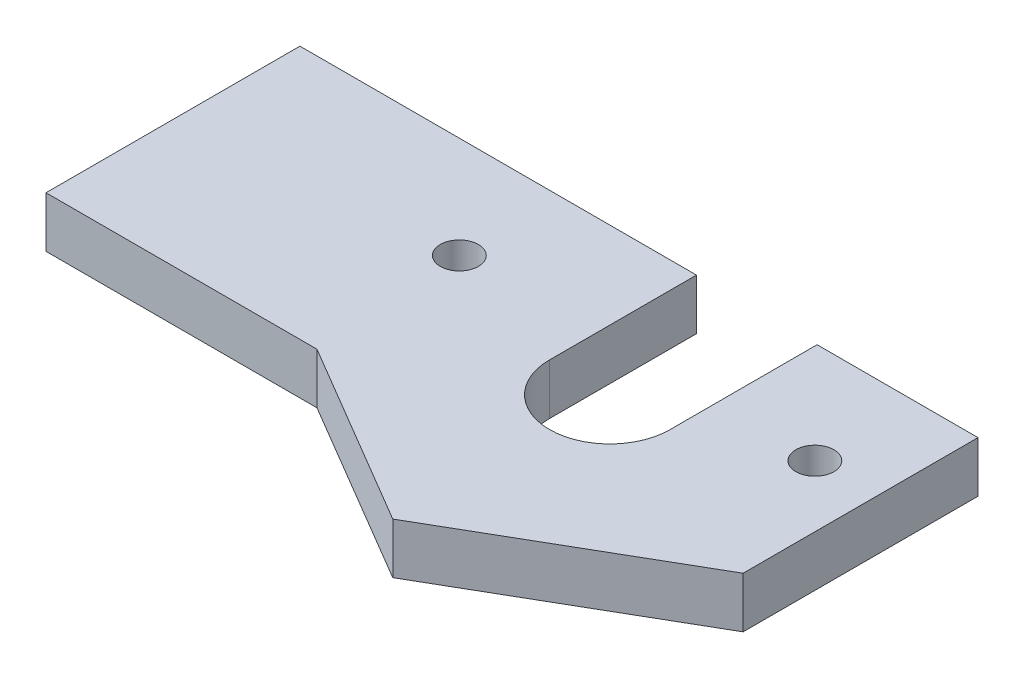
ISO-10303-21;
HEADER;
FILE_DESCRIPTION(('STEP AP214'),'2;1');
FILE_NAME('part.step','',(''),(''),'','','');
FILE_SCHEMA(('AUTOMOTIVE_DESIGN { 1 0 10303 214 1 1 1 1 }'));
ENDSEC;
DATA;
#1=APPLICATION_CONTEXT('core data for automotive mechanical design processes');
#2=APPLICATION_PROTOCOL_DEFINITION('international standard','automotive_design',2000,#1);
#3=PRODUCT_CONTEXT('',#1,'mechanical');
#4=PRODUCT('Part','Part','',(#3));
#5=PRODUCT_RELATED_PRODUCT_CATEGORY('part','',(#4));
#6=PRODUCT_DEFINITION_FORMATION('','',#4);
#7=PRODUCT_DEFINITION_CONTEXT('part definition',#1,'design');
#8=PRODUCT_DEFINITION('design','',#6,#7);
#9=PRODUCT_DEFINITION_SHAPE('','',#8);
#10=(LENGTH_UNIT() NAMED_UNIT(*) SI_UNIT(.MILLI.,.METRE.));
#11=(NAMED_UNIT(*) PLANE_ANGLE_UNIT() SI_UNIT($,.RADIAN.));
#12=(NAMED_UNIT(*) SI_UNIT($,.STERADIAN.) SOLID_ANGLE_UNIT());
#13=UNCERTAINTY_MEASURE_WITH_UNIT(LENGTH_MEASURE(1.E-05),#10,'distance_accuracy_value','');
#14=(GEOMETRIC_REPRESENTATION_CONTEXT(3) GLOBAL_UNCERTAINTY_ASSIGNED_CONTEXT((#13)) GLOBAL_UNIT_ASSIGNED_CONTEXT((#10,
#11,#12)) REPRESENTATION_CONTEXT('',''));
#15=CARTESIAN_POINT('',(0.,0.,0.));
#16=DIRECTION('',(0.,0.,1.));
#17=DIRECTION('',(1.,0.,0.));
#18=AXIS2_PLACEMENT_3D('',#15,#16,#17);
#19=CARTESIAN_POINT('',(-168.355,8.,0.));
#20=DIRECTION('',(1.,0.,0.));
#21=DIRECTION('',(0.,0.,-1.));
#22=AXIS2_PLACEMENT_3D('',#19,#20,#21);
#23=PLANE('',#22);
#24=DIRECTION('',(0.,0.,1.));
#25=VECTOR('',#24,1.);
#26=CARTESIAN_POINT('',(-168.355,4.,0.));
#27=LINE('',#26,#25);
#28=CARTESIAN_POINT('',(-168.355,4.,-143.95));
#29=VERTEX_POINT('',#28);
#30=CARTESIAN_POINT('',(-168.355,4.,-123.950000000005));
#31=VERTEX_POINT('',#30);
#32=EDGE_CURVE('E152',#29,#31,#27,.T.);
#33=ORIENTED_EDGE('',*,*,#32,.T.);
#34=DIRECTION('',(0.,-1.,0.));
#35=VECTOR('',#34,1.);
#36=CARTESIAN_POINT('',(-168.355,8.,-123.950000000005));
#37=LINE('',#36,#35);
#38=CARTESIAN_POINT('',(-168.355,8.,-123.950000000005));
#39=VERTEX_POINT('',#38);
#40=EDGE_CURVE('E11',#39,#31,#37,.T.);
#41=ORIENTED_EDGE('',*,*,#40,.F.);
#42=DIRECTION('',(0.,0.,1.));
#43=VECTOR('',#42,1.);
#44=CARTESIAN_POINT('',(-168.355,8.,0.));
#45=LINE('',#44,#43);
#46=CARTESIAN_POINT('',(-168.355,8.,-143.95));
#47=VERTEX_POINT('',#46);
#48=EDGE_CURVE('E97',#47,#39,#45,.T.);
#49=ORIENTED_EDGE('',*,*,#48,.F.);
#50=DIRECTION('',(0.,-1.,0.));
#51=VECTOR('',#50,1.);
#52=CARTESIAN_POINT('',(-168.355,8.,-143.95));
#53=LINE('',#52,#51);
#54=EDGE_CURVE('E53',#47,#29,#53,.T.);
#55=ORIENTED_EDGE('',*,*,#54,.T.);
#56=EDGE_LOOP('',(#33,#41,#49,#55));
#57=FACE_BOUND('',#56,.T.);
#58=ADVANCED_FACE('F37',(#57),#23,.F.);
#59=CARTESIAN_POINT('',(0.,8.,-123.950000000005));
#60=DIRECTION('',(0.,0.,1.));
#61=DIRECTION('',(1.,0.,0.));
#62=AXIS2_PLACEMENT_3D('',#59,#60,#61);
#63=PLANE('',#62);
#64=DIRECTION('',(-1.,0.,0.));
#65=VECTOR('',#64,1.);
#66=CARTESIAN_POINT('',(0.,4.,-123.950000000005));
#67=LINE('',#66,#65);
#68=CARTESIAN_POINT('',(-147.01444531744,4.,-123.950000000005));
#69=VERTEX_POINT('',#68);
#70=EDGE_CURVE('E154',#69,#31,#67,.T.);
#71=ORIENTED_EDGE('',*,*,#70,.F.);
#72=DIRECTION('',(0.,-1.,0.));
#73=VECTOR('',#72,1.);
#74=CARTESIAN_POINT('',(-147.01444531744,8.,-123.950000000005));
#75=LINE('',#74,#73);
#76=CARTESIAN_POINT('',(-147.01444531744,8.,-123.950000000005));
#77=VERTEX_POINT('',#76);
#78=EDGE_CURVE('E45',#77,#69,#75,.T.);
#79=ORIENTED_EDGE('',*,*,#78,.F.);
#80=DIRECTION('',(-1.,0.,0.));
#81=VECTOR('',#80,1.);
#82=CARTESIAN_POINT('',(0.,8.,-123.950000000005));
#83=LINE('',#82,#81);
#84=EDGE_CURVE('E214',#77,#39,#83,.T.);
#85=ORIENTED_EDGE('',*,*,#84,.T.);
#86=ORIENTED_EDGE('',*,*,#40,.T.);
#87=EDGE_LOOP('',(#71,#79,#85,#86));
#88=FACE_BOUND('',#87,.T.);
#89=ADVANCED_FACE('F201',(#88),#63,.T.);
#90=CARTESIAN_POINT('',(16.2740149052026,8.,-27.5723578123821));
#91=DIRECTION('',(-0.508295367968957,0.,0.861182802255888));
#92=DIRECTION('',(0.861182802255888,0.,0.508295367968957));
#93=AXIS2_PLACEMENT_3D('',#90,#91,#92);
#94=PLANE('',#93);
#95=DIRECTION('',(-0.861182802255888,0.,-0.508295367968957));
#96=VECTOR('',#95,1.);
#97=CARTESIAN_POINT('',(16.2740149052026,4.,-27.5723578123821));
#98=LINE('',#97,#96);
#99=CARTESIAN_POINT('',(-132.445175955673,4.,-115.35078957467));
#100=VERTEX_POINT('',#99);
#101=EDGE_CURVE('E157',#100,#69,#98,.T.);
#102=ORIENTED_EDGE('',*,*,#101,.F.);
#103=DIRECTION('',(0.,-1.,0.));
#104=VECTOR('',#103,1.);
#105=CARTESIAN_POINT('',(-132.445175955673,8.,-115.35078957467));
#106=LINE('',#105,#104);
#107=CARTESIAN_POINT('',(-132.445175955673,8.,-115.35078957467));
#108=VERTEX_POINT('',#107);
#109=EDGE_CURVE('E191',#108,#100,#106,.T.);
#110=ORIENTED_EDGE('',*,*,#109,.F.);
#111=DIRECTION('',(-0.861182802255888,0.,-0.508295367968957));
#112=VECTOR('',#111,1.);
#113=CARTESIAN_POINT('',(16.2740149052026,8.,-27.5723578123821));
#114=LINE('',#113,#112);
#115=EDGE_CURVE('E198',#108,#77,#114,.T.);
#116=ORIENTED_EDGE('',*,*,#115,.T.);
#117=ORIENTED_EDGE('',*,*,#78,.T.);
#118=EDGE_LOOP('',(#102,#110,#116,#117));
#119=FACE_BOUND('',#118,.T.);
#120=ADVANCED_FACE('F196',(#119),#94,.T.);
#121=CARTESIAN_POINT('',(-83.0596510480491,8.,-143.863535674159));
#122=DIRECTION('',(0.50000000000001,0.,0.866025403784433));
#123=DIRECTION('',(0.866025403784433,0.,-0.50000000000001));
#124=AXIS2_PLACEMENT_3D('',#121,#122,#123);
#125=PLANE('',#124);
#126=DIRECTION('',(-0.866025403784433,0.,0.50000000000001));
#127=VECTOR('',#126,1.);
#128=CARTESIAN_POINT('',(-83.0596510480491,4.,-143.863535674159));
#129=LINE('',#128,#127);
#130=CARTESIAN_POINT('',(-114.951926063695,4.,-125.450522108806));
#131=VERTEX_POINT('',#130);
#132=EDGE_CURVE('E160',#131,#100,#129,.T.);
#133=ORIENTED_EDGE('',*,*,#132,.F.);
#134=DIRECTION('',(0.,-1.,0.));
#135=VECTOR('',#134,1.);
#136=CARTESIAN_POINT('',(-114.951926063695,8.,-125.450522108806));
#137=LINE('',#136,#135);
#138=CARTESIAN_POINT('',(-114.951926063695,8.,-125.450522108806));
#139=VERTEX_POINT('',#138);
#140=EDGE_CURVE('E189',#139,#131,#137,.T.);
#141=ORIENTED_EDGE('',*,*,#140,.F.);
#142=DIRECTION('',(-0.866025403784433,0.,0.50000000000001));
#143=VECTOR('',#142,1.);
#144=CARTESIAN_POINT('',(-83.0596510480491,8.,-143.863535674159));
#145=LINE('',#144,#143);
#146=EDGE_CURVE('E211',#139,#108,#145,.T.);
#147=ORIENTED_EDGE('',*,*,#146,.T.);
#148=ORIENTED_EDGE('',*,*,#109,.T.);
#149=EDGE_LOOP('',(#133,#141,#147,#148));
#150=FACE_BOUND('',#149,.T.);
#151=ADVANCED_FACE('F208',(#150),#125,.T.);
#152=CARTESIAN_POINT('',(-114.951926063695,8.,0.));
#153=DIRECTION('',(1.,0.,0.));
#154=DIRECTION('',(0.,0.,-1.));
#155=AXIS2_PLACEMENT_3D('',#152,#153,#154);
#156=PLANE('',#155);
#157=DIRECTION('',(0.,0.,1.));
#158=VECTOR('',#157,1.);
#159=CARTESIAN_POINT('',(-114.951926063695,4.,0.));
#160=LINE('',#159,#158);
#161=CARTESIAN_POINT('',(-114.951926063695,4.,-143.95));
#162=VERTEX_POINT('',#161);
#163=EDGE_CURVE('E163',#162,#131,#160,.T.);
#164=ORIENTED_EDGE('',*,*,#163,.F.);
#165=DIRECTION('',(0.,-1.,0.));
#166=VECTOR('',#165,1.);
#167=CARTESIAN_POINT('',(-114.951926063695,8.,-143.95));
#168=LINE('',#167,#166);
#169=CARTESIAN_POINT('',(-114.951926063695,8.,-143.95));
#170=VERTEX_POINT('',#169);
#171=EDGE_CURVE('E187',#170,#162,#168,.T.);
#172=ORIENTED_EDGE('',*,*,#171,.F.);
#173=DIRECTION('',(0.,0.,1.));
#174=VECTOR('',#173,1.);
#175=CARTESIAN_POINT('',(-114.951926063695,8.,0.));
#176=LINE('',#175,#174);
#177=EDGE_CURVE('E216',#170,#139,#176,.T.);
#178=ORIENTED_EDGE('',*,*,#177,.T.);
#179=ORIENTED_EDGE('',*,*,#140,.T.);
#180=EDGE_LOOP('',(#164,#172,#178,#179));
#181=FACE_BOUND('',#180,.T.);
#182=ADVANCED_FACE('F241',(#181),#156,.T.);
#183=CARTESIAN_POINT('',(0.,8.,-143.95));
#184=DIRECTION('',(0.,0.,-1.));
#185=DIRECTION('',(-1.,0.,0.));
#186=AXIS2_PLACEMENT_3D('',#183,#184,#185);
#187=PLANE('',#186);
#188=DIRECTION('',(1.,0.,0.));
#189=VECTOR('',#188,1.);
#190=CARTESIAN_POINT('',(0.,4.,-143.95));
#191=LINE('',#190,#189);
#192=CARTESIAN_POINT('',(-127.625,4.,-143.95));
#193=VERTEX_POINT('',#192);
#194=EDGE_CURVE('E166',#193,#162,#191,.T.);
#195=ORIENTED_EDGE('',*,*,#194,.F.);
#196=DIRECTION('',(0.,-1.,0.));
#197=VECTOR('',#196,1.);
#198=CARTESIAN_POINT('',(-127.625,8.,-143.95));
#199=LINE('',#198,#197);
#200=CARTESIAN_POINT('',(-127.625,8.,-143.95));
#201=VERTEX_POINT('',#200);
#202=EDGE_CURVE('E185',#201,#193,#199,.T.);
#203=ORIENTED_EDGE('',*,*,#202,.F.);
#204=DIRECTION('',(1.,0.,0.));
#205=VECTOR('',#204,1.);
#206=CARTESIAN_POINT('',(0.,8.,-143.95));
#207=LINE('',#206,#205);
#208=EDGE_CURVE('E142',#201,#170,#207,.T.);
#209=ORIENTED_EDGE('',*,*,#208,.T.);
#210=ORIENTED_EDGE('',*,*,#171,.T.);
#211=EDGE_LOOP('',(#195,#203,#209,#210));
#212=FACE_BOUND('',#211,.T.);
#213=ADVANCED_FACE('F229',(#212),#187,.T.);
#214=CARTESIAN_POINT('',(-127.625,8.,0.));
#215=DIRECTION('',(-1.,0.,0.));
#216=DIRECTION('',(0.,0.,1.));
#217=AXIS2_PLACEMENT_3D('',#214,#215,#216);
#218=PLANE('',#217);
#219=DIRECTION('',(0.,0.,-1.));
#220=VECTOR('',#219,1.);
#221=CARTESIAN_POINT('',(-127.625,4.,0.));
#222=LINE('',#221,#220);
#223=CARTESIAN_POINT('',(-127.625,4.,-132.375000000014));
#224=VERTEX_POINT('',#223);
#225=EDGE_CURVE('E169',#224,#193,#222,.T.);
#226=ORIENTED_EDGE('',*,*,#225,.F.);
#227=DIRECTION('',(0.,-1.,0.));
#228=VECTOR('',#227,1.);
#229=CARTESIAN_POINT('',(-127.625,8.,-132.375000000014));
#230=LINE('',#229,#228);
#231=CARTESIAN_POINT('',(-127.625,8.,-132.375000000014));
#232=VERTEX_POINT('',#231);
#233=EDGE_CURVE('E129',#232,#224,#230,.T.);
#234=ORIENTED_EDGE('',*,*,#233,.F.);
#235=DIRECTION('',(0.,0.,-1.));
#236=VECTOR('',#235,1.);
#237=CARTESIAN_POINT('',(-127.625,8.,0.));
#238=LINE('',#237,#236);
#239=EDGE_CURVE('E140',#232,#201,#238,.T.);
#240=ORIENTED_EDGE('',*,*,#239,.T.);
#241=ORIENTED_EDGE('',*,*,#202,.T.);
#242=EDGE_LOOP('',(#226,#234,#240,#241));
#243=FACE_BOUND('',#242,.T.);
#244=ADVANCED_FACE('F240',(#243),#218,.T.);
#245=CARTESIAN_POINT('',(-132.375,8.,-132.375000000014));
#246=DIRECTION('',(0.,-1.,0.));
#247=DIRECTION('',(0.,0.,-1.));
#248=AXIS2_PLACEMENT_3D('',#245,#246,#247);
#249=CYLINDRICAL_SURFACE('',#248,4.75000000000001);
#250=CARTESIAN_POINT('',(-132.375,4.,-132.375000000014));
#251=DIRECTION('',(0.,1.,0.));
#252=DIRECTION('',(0.,0.,1.));
#253=AXIS2_PLACEMENT_3D('',#250,#251,#252);
#254=CIRCLE('',#253,4.75000000000001);
#255=CARTESIAN_POINT('',(-137.125,4.,-132.375000000014));
#256=VERTEX_POINT('',#255);
#257=EDGE_CURVE('E126',#256,#224,#254,.T.);
#258=ORIENTED_EDGE('',*,*,#257,.F.);
#259=DIRECTION('',(0.,-1.,0.));
#260=VECTOR('',#259,1.);
#261=CARTESIAN_POINT('',(-137.125,8.,-132.375000000014));
#262=LINE('',#261,#260);
#263=CARTESIAN_POINT('',(-137.125,8.,-132.375000000014));
#264=VERTEX_POINT('',#263);
#265=EDGE_CURVE('E120',#264,#256,#262,.T.);
#266=ORIENTED_EDGE('',*,*,#265,.F.);
#267=CARTESIAN_POINT('',(-132.375,8.,-132.375000000014));
#268=DIRECTION('',(0.,1.,0.));
#269=DIRECTION('',(0.,0.,1.));
#270=AXIS2_PLACEMENT_3D('',#267,#268,#269);
#271=CIRCLE('',#270,4.75000000000001);
#272=EDGE_CURVE('E124',#264,#232,#271,.T.);
#273=ORIENTED_EDGE('',*,*,#272,.T.);
#274=ORIENTED_EDGE('',*,*,#233,.T.);
#275=EDGE_LOOP('',(#258,#266,#273,#274));
#276=FACE_BOUND('',#275,.T.);
#277=ADVANCED_FACE('F122',(#276),#249,.F.);
#278=CARTESIAN_POINT('',(-137.125,8.,0.));
#279=DIRECTION('',(-1.,0.,0.));
#280=DIRECTION('',(0.,0.,1.));
#281=AXIS2_PLACEMENT_3D('',#278,#279,#280);
#282=PLANE('',#281);
#283=DIRECTION('',(0.,0.,-1.));
#284=VECTOR('',#283,1.);
#285=CARTESIAN_POINT('',(-137.125,4.,0.));
#286=LINE('',#285,#284);
#287=CARTESIAN_POINT('',(-137.125,4.,-143.95));
#288=VERTEX_POINT('',#287);
#289=EDGE_CURVE('E174',#256,#288,#286,.T.);
#290=ORIENTED_EDGE('',*,*,#289,.T.);
#291=DIRECTION('',(0.,-1.,0.));
#292=VECTOR('',#291,1.);
#293=CARTESIAN_POINT('',(-137.125,8.,-143.95));
#294=LINE('',#293,#292);
#295=CARTESIAN_POINT('',(-137.125,8.,-143.95));
#296=VERTEX_POINT('',#295);
#297=EDGE_CURVE('E85',#296,#288,#294,.T.);
#298=ORIENTED_EDGE('',*,*,#297,.F.);
#299=DIRECTION('',(0.,0.,-1.));
#300=VECTOR('',#299,1.);
#301=CARTESIAN_POINT('',(-137.125,8.,0.));
#302=LINE('',#301,#300);
#303=EDGE_CURVE('E131',#264,#296,#302,.T.);
#304=ORIENTED_EDGE('',*,*,#303,.F.);
#305=ORIENTED_EDGE('',*,*,#265,.T.);
#306=EDGE_LOOP('',(#290,#298,#304,#305));
#307=FACE_BOUND('',#306,.T.);
#308=ADVANCED_FACE('F132',(#307),#282,.F.);
#309=CARTESIAN_POINT('',(-119.800597829953,8.,-135.950000000011));
#310=DIRECTION('',(0.,-1.,0.));
#311=DIRECTION('',(0.,0.,-1.));
#312=AXIS2_PLACEMENT_3D('',#309,#310,#311);
#313=CYLINDRICAL_SURFACE('',#312,1.5);
#314=CARTESIAN_POINT('',(-119.800597829953,8.,-135.950000000011));
#315=DIRECTION('',(0.,1.,0.));
#316=DIRECTION('',(0.,0.,1.));
#317=AXIS2_PLACEMENT_3D('',#314,#315,#316);
#318=CIRCLE('',#317,1.5);
#319=CARTESIAN_POINT('',(-119.800597829953,8.,-134.450000000011));
#320=VERTEX_POINT('',#319);
#321=EDGE_CURVE('E146',#320,#320,#318,.T.);
#322=ORIENTED_EDGE('',*,*,#321,.T.);
#323=EDGE_LOOP('',(#322));
#324=FACE_BOUND('',#323,.T.);
#325=CARTESIAN_POINT('',(-119.800597829953,4.,-135.950000000011));
#326=DIRECTION('',(0.,1.,0.));
#327=DIRECTION('',(0.,0.,1.));
#328=AXIS2_PLACEMENT_3D('',#325,#326,#327);
#329=CIRCLE('',#328,1.5);
#330=CARTESIAN_POINT('',(-119.800597829953,4.,-134.450000000011));
#331=VERTEX_POINT('',#330);
#332=EDGE_CURVE('E176',#331,#331,#329,.T.);
#333=ORIENTED_EDGE('',*,*,#332,.F.);
#334=EDGE_LOOP('',(#333));
#335=FACE_BOUND('',#334,.T.);
#336=ADVANCED_FACE('F227',(#324,#335),#313,.F.);
#337=EDGE_CURVE('E170',#29,#288,#191,.T.);
#338=ORIENTED_EDGE('',*,*,#337,.F.);
#339=ORIENTED_EDGE('',*,*,#54,.F.);
#340=EDGE_CURVE('E133',#47,#296,#207,.T.);
#341=ORIENTED_EDGE('',*,*,#340,.T.);
#342=ORIENTED_EDGE('',*,*,#297,.T.);
#343=EDGE_LOOP('',(#338,#339,#341,#342));
#344=FACE_BOUND('',#343,.T.);
#345=ADVANCED_FACE('F223',(#344),#187,.T.);
#346=CARTESIAN_POINT('',(-147.800597829953,8.,-135.950000000011));
#347=DIRECTION('',(0.,-1.,0.));
#348=DIRECTION('',(0.,0.,-1.));
#349=AXIS2_PLACEMENT_3D('',#346,#347,#348);
#350=CYLINDRICAL_SURFACE('',#349,1.5);
#351=CARTESIAN_POINT('',(-147.800597829953,8.,-135.950000000011));
#352=DIRECTION('',(0.,1.,0.));
#353=DIRECTION('',(0.,0.,1.));
#354=AXIS2_PLACEMENT_3D('',#351,#352,#353);
#355=CIRCLE('',#354,1.5);
#356=CARTESIAN_POINT('',(-147.800597829953,8.,-134.450000000011));
#357=VERTEX_POINT('',#356);
#358=EDGE_CURVE('E149',#357,#357,#355,.T.);
#359=ORIENTED_EDGE('',*,*,#358,.T.);
#360=EDGE_LOOP('',(#359));
#361=FACE_BOUND('',#360,.T.);
#362=CARTESIAN_POINT('',(-147.800597829953,4.,-135.950000000011));
#363=DIRECTION('',(0.,1.,0.));
#364=DIRECTION('',(0.,0.,1.));
#365=AXIS2_PLACEMENT_3D('',#362,#363,#364);
#366=CIRCLE('',#365,1.5);
#367=CARTESIAN_POINT('',(-147.800597829953,4.,-134.450000000011));
#368=VERTEX_POINT('',#367);
#369=EDGE_CURVE('E179',#368,#368,#366,.T.);
#370=ORIENTED_EDGE('',*,*,#369,.F.);
#371=EDGE_LOOP('',(#370));
#372=FACE_BOUND('',#371,.T.);
#373=ADVANCED_FACE('F226',(#361,#372),#350,.F.);
#374=CARTESIAN_POINT('',(0.,8.,0.));
#375=DIRECTION('',(0.,1.,0.));
#376=DIRECTION('',(0.,0.,1.));
#377=AXIS2_PLACEMENT_3D('',#374,#375,#376);
#378=PLANE('',#377);
#379=ORIENTED_EDGE('',*,*,#48,.T.);
#380=ORIENTED_EDGE('',*,*,#84,.F.);
#381=ORIENTED_EDGE('',*,*,#115,.F.);
#382=ORIENTED_EDGE('',*,*,#146,.F.);
#383=ORIENTED_EDGE('',*,*,#177,.F.);
#384=ORIENTED_EDGE('',*,*,#208,.F.);
#385=ORIENTED_EDGE('',*,*,#239,.F.);
#386=ORIENTED_EDGE('',*,*,#272,.F.);
#387=ORIENTED_EDGE('',*,*,#303,.T.);
#388=ORIENTED_EDGE('',*,*,#340,.F.);
#389=EDGE_LOOP('',(#379,#380,#381,#382,#383,#384,#385,#386,#387,#388));
#390=FACE_BOUND('',#389,.T.);
#391=ORIENTED_EDGE('',*,*,#321,.F.);
#392=EDGE_LOOP('',(#391));
#393=FACE_BOUND('',#392,.T.);
#394=ORIENTED_EDGE('',*,*,#358,.F.);
#395=EDGE_LOOP('',(#394));
#396=FACE_BOUND('',#395,.T.);
#397=ADVANCED_FACE('F136',(#390,#393,#396),#378,.T.);
#398=CARTESIAN_POINT('',(0.,4.,0.));
#399=DIRECTION('',(0.,1.,0.));
#400=DIRECTION('',(0.,0.,1.));
#401=AXIS2_PLACEMENT_3D('',#398,#399,#400);
#402=PLANE('',#401);
#403=ORIENTED_EDGE('',*,*,#32,.F.);
#404=ORIENTED_EDGE('',*,*,#337,.T.);
#405=ORIENTED_EDGE('',*,*,#289,.F.);
#406=ORIENTED_EDGE('',*,*,#257,.T.);
#407=ORIENTED_EDGE('',*,*,#225,.T.);
#408=ORIENTED_EDGE('',*,*,#194,.T.);
#409=ORIENTED_EDGE('',*,*,#163,.T.);
#410=ORIENTED_EDGE('',*,*,#132,.T.);
#411=ORIENTED_EDGE('',*,*,#101,.T.);
#412=ORIENTED_EDGE('',*,*,#70,.T.);
#413=EDGE_LOOP('',(#403,#404,#405,#406,#407,#408,#409,#410,#411,#412));
#414=FACE_BOUND('',#413,.T.);
#415=ORIENTED_EDGE('',*,*,#332,.T.);
#416=EDGE_LOOP('',(#415));
#417=FACE_BOUND('',#416,.T.);
#418=ORIENTED_EDGE('',*,*,#369,.T.);
#419=EDGE_LOOP('',(#418));
#420=FACE_BOUND('',#419,.T.);
#421=ADVANCED_FACE('F203',(#414,#417,#420),#402,.F.);
#422=CLOSED_SHELL('',(#58,#89,#120,#151,#182,#213,#244,#277,#308,#336,#345,#373,#397,#421));
#423=MANIFOLD_SOLID_BREP('B2',#422);
#424=ADVANCED_BREP_SHAPE_REPRESENTATION('',(#18,#423),#14);
#425=SHAPE_DEFINITION_REPRESENTATION(#9,#424);
ENDSEC;
END-ISO-10303-21;
